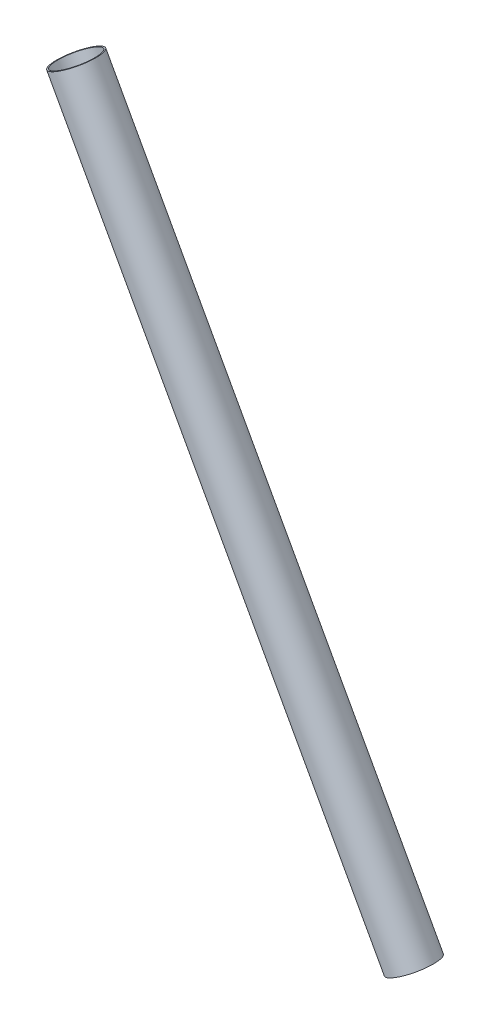
ISO-10303-21;
HEADER;
FILE_DESCRIPTION(('STEP AP214'),'2;1');
FILE_NAME('part.step','',(''),(''),'','','');
FILE_SCHEMA(('AUTOMOTIVE_DESIGN { 1 0 10303 214 1 1 1 1 }'));
ENDSEC;
DATA;
#1=APPLICATION_CONTEXT('core data for automotive mechanical design processes');
#2=APPLICATION_PROTOCOL_DEFINITION('international standard','automotive_design',2000,#1);
#3=PRODUCT_CONTEXT('',#1,'mechanical');
#4=PRODUCT('Part','Part','',(#3));
#5=PRODUCT_RELATED_PRODUCT_CATEGORY('part','',(#4));
#6=PRODUCT_DEFINITION_FORMATION('','',#4);
#7=PRODUCT_DEFINITION_CONTEXT('part definition',#1,'design');
#8=PRODUCT_DEFINITION('design','',#6,#7);
#9=PRODUCT_DEFINITION_SHAPE('','',#8);
#10=(LENGTH_UNIT() NAMED_UNIT(*) SI_UNIT(.MILLI.,.METRE.));
#11=(NAMED_UNIT(*) PLANE_ANGLE_UNIT() SI_UNIT($,.RADIAN.));
#12=(NAMED_UNIT(*) SI_UNIT($,.STERADIAN.) SOLID_ANGLE_UNIT());
#13=UNCERTAINTY_MEASURE_WITH_UNIT(LENGTH_MEASURE(1.E-05),#10,'distance_accuracy_value','');
#14=(GEOMETRIC_REPRESENTATION_CONTEXT(3) GLOBAL_UNCERTAINTY_ASSIGNED_CONTEXT((#13)) GLOBAL_UNIT_ASSIGNED_CONTEXT((#10,
#11,#12)) REPRESENTATION_CONTEXT('',''));
#15=CARTESIAN_POINT('',(0.,0.,0.));
#16=DIRECTION('',(0.,0.,1.));
#17=DIRECTION('',(1.,0.,0.));
#18=AXIS2_PLACEMENT_3D('',#15,#16,#17);
#19=CARTESIAN_POINT('',(-328.619941220099,746.118381252741,0.));
#20=DIRECTION('',(-0.480781588258264,0.876840387067031,0.));
#21=DIRECTION('',(-0.876840387067032,-0.480781588258263,0.));
#22=AXIS2_PLACEMENT_3D('',#19,#20,#21);
#23=CYLINDRICAL_SURFACE('',#22,25.3999999999946);
#24=CARTESIAN_POINT('',(-328.619941220099,746.11838125274,0.));
#25=DIRECTION('',(-0.480781588258264,0.876840387067031,0.));
#26=DIRECTION('',(-0.876840387067032,-0.480781588258263,0.));
#27=AXIS2_PLACEMENT_3D('',#24,#25,#26);
#28=CIRCLE('',#27,25.3999999999996);
#29=CARTESIAN_POINT('',(-350.891687051597,733.906528910983,0.));
#30=VERTEX_POINT('',#29);
#31=EDGE_CURVE('E10',#30,#30,#28,.T.);
#32=CARTESIAN_POINT('',(56.0534075453374,44.558387560409,0.));
#33=DIRECTION('',(-0.480781588258264,0.876840387067031,0.));
#34=DIRECTION('',(-0.876840387067032,-0.480781588258263,0.));
#35=AXIS2_PLACEMENT_3D('',#32,#33,#34);
#36=CIRCLE('',#35,25.3999999999895);
#37=CARTESIAN_POINT('',(33.7816617138396,32.3465352186516,0.));
#38=VERTEX_POINT('',#37);
#39=EDGE_CURVE('E46',#38,#38,#36,.T.);
#40=CARTESIAN_POINT('',(-350.891687051597,733.906528910983,0.));
#41=CARTESIAN_POINT('',(-346.884673001957,726.598612310021,0.));
#42=CARTESIAN_POINT('',(-342.877658952317,719.290695709059,0.));
#43=CARTESIAN_POINT('',(-334.863630853037,704.674862507136,0.));
#44=CARTESIAN_POINT('',(-330.856616803397,697.366945906174,0.));
#45=CARTESIAN_POINT('',(-322.842588704117,682.751112704251,0.));
#46=CARTESIAN_POINT('',(-318.835574654477,675.443196103289,0.));
#47=CARTESIAN_POINT('',(-310.821546555197,660.827362901365,0.));
#48=CARTESIAN_POINT('',(-306.814532505557,653.519446300403,0.));
#49=CARTESIAN_POINT('',(-298.800504406277,638.90361309848,0.));
#50=CARTESIAN_POINT('',(-294.793490356637,631.595696497518,0.));
#51=CARTESIAN_POINT('',(-286.779462257358,616.979863295595,0.));
#52=CARTESIAN_POINT('',(-282.772448207718,609.671946694633,0.));
#53=CARTESIAN_POINT('',(-274.758420108438,595.056113492709,0.));
#54=CARTESIAN_POINT('',(-270.751406058798,587.748196891747,0.));
#55=CARTESIAN_POINT('',(-262.737377959518,573.132363689824,0.));
#56=CARTESIAN_POINT('',(-258.730363909878,565.824447088862,0.));
#57=CARTESIAN_POINT('',(-250.716335810598,551.208613886938,0.));
#58=CARTESIAN_POINT('',(-246.709321760958,543.900697285977,0.));
#59=CARTESIAN_POINT('',(-238.695293661678,529.284864084053,0.));
#60=CARTESIAN_POINT('',(-234.688279612038,521.976947483091,0.));
#61=CARTESIAN_POINT('',(-226.674251512758,507.361114281168,0.));
#62=CARTESIAN_POINT('',(-222.667237463118,500.053197680206,0.));
#63=CARTESIAN_POINT('',(-214.653209363838,485.437364478282,0.));
#64=CARTESIAN_POINT('',(-210.646195314198,478.129447877321,0.));
#65=CARTESIAN_POINT('',(-202.632167214918,463.513614675397,0.));
#66=CARTESIAN_POINT('',(-198.625153165278,456.205698074435,0.));
#67=CARTESIAN_POINT('',(-190.611125065998,441.589864872512,0.));
#68=CARTESIAN_POINT('',(-186.604111016358,434.28194827155,0.));
#69=CARTESIAN_POINT('',(-178.590082917079,419.666115069626,0.));
#70=CARTESIAN_POINT('',(-174.583068867439,412.358198468665,0.));
#71=CARTESIAN_POINT('',(-166.569040768159,397.742365266741,0.));
#72=CARTESIAN_POINT('',(-162.562026718519,390.434448665779,0.));
#73=CARTESIAN_POINT('',(-154.547998619239,375.818615463856,0.));
#74=CARTESIAN_POINT('',(-150.540984569599,368.510698862894,0.));
#75=CARTESIAN_POINT('',(-142.526956470319,353.89486566097,0.));
#76=CARTESIAN_POINT('',(-138.519942420679,346.586949060008,0.));
#77=CARTESIAN_POINT('',(-130.505914321399,331.971115858085,0.));
#78=CARTESIAN_POINT('',(-126.498900271759,324.663199257123,0.));
#79=CARTESIAN_POINT('',(-118.484872172479,310.0473660552,0.));
#80=CARTESIAN_POINT('',(-114.477858122839,302.739449454238,0.));
#81=CARTESIAN_POINT('',(-106.463830023559,288.123616252314,0.));
#82=CARTESIAN_POINT('',(-102.456815973919,280.815699651352,0.));
#83=CARTESIAN_POINT('',(-94.4427878746393,266.199866449429,0.));
#84=CARTESIAN_POINT('',(-90.4357738249993,258.891949848467,0.));
#85=CARTESIAN_POINT('',(-82.4217457257194,244.276116646543,0.));
#86=CARTESIAN_POINT('',(-78.4147316760794,236.968200045582,0.));
#87=CARTESIAN_POINT('',(-70.4007035767995,222.352366843658,0.));
#88=CARTESIAN_POINT('',(-66.3936895271595,215.044450242696,0.));
#89=CARTESIAN_POINT('',(-58.3796614278796,200.428617040773,0.));
#90=CARTESIAN_POINT('',(-54.3726473782396,193.120700439811,0.));
#91=CARTESIAN_POINT('',(-46.3586192789597,178.504867237887,0.));
#92=CARTESIAN_POINT('',(-42.3516052293198,171.196950636926,0.));
#93=CARTESIAN_POINT('',(-34.3375771300398,156.581117435002,0.));
#94=CARTESIAN_POINT('',(-30.3305630803999,149.27320083404,0.));
#95=CARTESIAN_POINT('',(-22.3165349811199,134.657367632117,0.));
#96=CARTESIAN_POINT('',(-18.30952093148,127.349451031155,0.));
#97=CARTESIAN_POINT('',(-10.2954928322,112.733617829231,0.));
#98=CARTESIAN_POINT('',(-6.28847878256003,105.425701228269,0.));
#99=CARTESIAN_POINT('',(1.72554931671987,90.8098680263459,0.));
#100=CARTESIAN_POINT('',(5.7325633663598,83.5019514253842,0.));
#101=CARTESIAN_POINT('',(13.7465914656397,68.8861182234606,0.));
#102=CARTESIAN_POINT('',(17.7536055152797,61.5782016224988,0.));
#103=CARTESIAN_POINT('',(25.7676336145596,46.9623684205752,0.));
#104=CARTESIAN_POINT('',(29.7746476641996,39.6544518196134,0.));
#105=CARTESIAN_POINT('',(33.7816617138396,32.3465352186516,0.));
#106=B_SPLINE_CURVE_WITH_KNOTS('',3,(#40,#41,#42,#43,#44,#45,#46,#47,#48,#49,#50,#51,#52,#53,
#54,#55,#56,#57,#58,#59,#60,#61,#62,#63,#64,#65,#66,#67,#68,#69,#70,#71,#72,#73,#74,#75,#76,#77,
#78,#79,#80,#81,#82,#83,#84,#85,#86,#87,#88,#89,#90,#91,#92,#93,#94,#95,#96,#97,#98,#99,#100,
#101,#102,#103,#104,#105),.UNSPECIFIED.,.F.,.F.,(4,2,2,2,2,2,2,2,2,2,2,2,2,2,2,2,2,2,2,2,2,2,2,
2,2,2,2,2,2,2,2,2,4),(0.,25.003125,50.00625,75.0093749999999,100.0125,125.015625,150.01875,
175.021875,200.025,225.028125,250.03125,275.034375,300.0375,325.040625,350.04375,375.046875,
400.05,425.053125,450.05625,475.059375,500.0625,525.065625,550.06875,575.071875,600.075,
625.078125,650.08125,675.084375,700.0875,725.090625,750.09375,775.096875,800.1),.UNSPECIFIED.);
#107=EDGE_CURVE('BSEAM39',#30,#38,#106,.T.);
#108=ORIENTED_EDGE('',*,*,#31,.F.);
#109=ORIENTED_EDGE('',*,*,#39,.T.);
#110=ORIENTED_EDGE('',*,*,#107,.T.);
#111=ORIENTED_EDGE('',*,*,#107,.F.);
#112=EDGE_LOOP('',(#108,#110,#109,#111));
#113=FACE_BOUND('',#112,.T.);
#114=ADVANCED_FACE('F39',(#113),#23,.T.);
#115=CARTESIAN_POINT('',(-328.619941220099,746.118381252741,0.));
#116=DIRECTION('',(0.480781588258264,-0.876840387067031,0.));
#117=DIRECTION('',(0.876840387067032,0.480781588258263,0.));
#118=AXIS2_PLACEMENT_3D('',#115,#116,#117);
#119=PLANE('',#118);
#120=CARTESIAN_POINT('',(-328.619941220099,746.118381252741,0.));
#121=DIRECTION('',(0.480781588258264,-0.876840387067031,0.));
#122=DIRECTION('',(0.876840387067032,0.480781588258263,0.));
#123=AXIS2_PLACEMENT_3D('',#120,#121,#122);
#124=CIRCLE('',#123,23.8124999999946);
#125=CARTESIAN_POINT('',(-349.499702937128,734.669769682343,0.));
#126=VERTEX_POINT('',#125);
#127=EDGE_CURVE('E52',#126,#126,#124,.F.);
#128=ORIENTED_EDGE('',*,*,#127,.F.);
#129=EDGE_LOOP('',(#128));
#130=FACE_BOUND('',#129,.T.);
#131=ORIENTED_EDGE('',*,*,#31,.T.);
#132=EDGE_LOOP('',(#131));
#133=FACE_BOUND('',#132,.T.);
#134=ADVANCED_FACE('F76',(#130,#133),#119,.F.);
#135=CARTESIAN_POINT('',(56.0534075453373,44.558387560409,0.));
#136=DIRECTION('',(-0.480781588258264,0.876840387067031,0.));
#137=DIRECTION('',(-0.876840387067032,-0.480781588258263,0.));
#138=AXIS2_PLACEMENT_3D('',#135,#136,#137);
#139=PLANE('',#138);
#140=CARTESIAN_POINT('',(56.0534075453374,44.558387560409,0.));
#141=DIRECTION('',(-0.480781588258264,0.876840387067031,0.));
#142=DIRECTION('',(-0.876840387067032,-0.480781588258263,0.));
#143=AXIS2_PLACEMENT_3D('',#140,#141,#142);
#144=CIRCLE('',#143,23.8124999999946);
#145=CARTESIAN_POINT('',(35.1736458283085,33.1097759900116,0.));
#146=VERTEX_POINT('',#145);
#147=EDGE_CURVE('E58',#146,#146,#144,.T.);
#148=ORIENTED_EDGE('',*,*,#147,.T.);
#149=EDGE_LOOP('',(#148));
#150=FACE_BOUND('',#149,.T.);
#151=ORIENTED_EDGE('',*,*,#39,.F.);
#152=EDGE_LOOP('',(#151));
#153=FACE_BOUND('',#152,.T.);
#154=ADVANCED_FACE('F66',(#150,#153),#139,.F.);
#155=CARTESIAN_POINT('',(-328.619941220099,746.118381252741,0.));
#156=DIRECTION('',(-0.480781588258264,0.876840387067031,0.));
#157=DIRECTION('',(-0.876840387067032,-0.480781588258263,0.));
#158=AXIS2_PLACEMENT_3D('',#155,#156,#157);
#159=CYLINDRICAL_SURFACE('',#158,23.8124999999946);
#160=CARTESIAN_POINT('',(-349.499702937128,734.669769682343,0.));
#161=CARTESIAN_POINT('',(-345.492688887488,727.361853081381,0.));
#162=CARTESIAN_POINT('',(-341.485674837848,720.05393648042,0.));
#163=CARTESIAN_POINT('',(-333.471646738568,705.438103278496,0.));
#164=CARTESIAN_POINT('',(-329.464632688928,698.130186677534,0.));
#165=CARTESIAN_POINT('',(-321.450604589648,683.514353475611,0.));
#166=CARTESIAN_POINT('',(-317.443590540008,676.206436874649,0.));
#167=CARTESIAN_POINT('',(-309.429562440728,661.590603672725,0.));
#168=CARTESIAN_POINT('',(-305.422548391089,654.282687071764,0.));
#169=CARTESIAN_POINT('',(-297.408520291809,639.66685386984,0.));
#170=CARTESIAN_POINT('',(-293.401506242169,632.358937268878,0.));
#171=CARTESIAN_POINT('',(-285.387478142889,617.743104066955,0.));
#172=CARTESIAN_POINT('',(-281.380464093249,610.435187465993,0.));
#173=CARTESIAN_POINT('',(-273.366435993969,595.819354264069,0.));
#174=CARTESIAN_POINT('',(-269.359421944329,588.511437663108,0.));
#175=CARTESIAN_POINT('',(-261.345393845049,573.895604461184,0.));
#176=CARTESIAN_POINT('',(-257.338379795409,566.587687860222,0.));
#177=CARTESIAN_POINT('',(-249.324351696129,551.971854658299,0.));
#178=CARTESIAN_POINT('',(-245.317337646489,544.663938057337,0.));
#179=CARTESIAN_POINT('',(-237.303309547209,530.048104855413,0.));
#180=CARTESIAN_POINT('',(-233.296295497569,522.740188254451,0.));
#181=CARTESIAN_POINT('',(-225.282267398289,508.124355052528,0.));
#182=CARTESIAN_POINT('',(-221.275253348649,500.816438451566,0.));
#183=CARTESIAN_POINT('',(-213.261225249369,486.200605249642,0.));
#184=CARTESIAN_POINT('',(-209.254211199729,478.892688648681,0.));
#185=CARTESIAN_POINT('',(-201.240183100449,464.276855446757,0.));
#186=CARTESIAN_POINT('',(-197.23316905081,456.968938845795,0.));
#187=CARTESIAN_POINT('',(-189.21914095153,442.353105643872,0.));
#188=CARTESIAN_POINT('',(-185.21212690189,435.04518904291,0.));
#189=CARTESIAN_POINT('',(-177.19809880261,420.429355840986,0.));
#190=CARTESIAN_POINT('',(-173.19108475297,413.121439240025,0.));
#191=CARTESIAN_POINT('',(-165.17705665369,398.505606038101,0.));
#192=CARTESIAN_POINT('',(-161.17004260405,391.197689437139,0.));
#193=CARTESIAN_POINT('',(-153.15601450477,376.581856235216,0.));
#194=CARTESIAN_POINT('',(-149.14900045513,369.273939634254,0.));
#195=CARTESIAN_POINT('',(-141.13497235585,354.65810643233,0.));
#196=CARTESIAN_POINT('',(-137.12795830621,347.350189831369,0.));
#197=CARTESIAN_POINT('',(-129.11393020693,332.734356629445,0.));
#198=CARTESIAN_POINT('',(-125.10691615729,325.426440028483,0.));
#199=CARTESIAN_POINT('',(-117.09288805801,310.81060682656,0.));
#200=CARTESIAN_POINT('',(-113.08587400837,303.502690225598,0.));
#201=CARTESIAN_POINT('',(-105.07184590909,288.886857023674,0.));
#202=CARTESIAN_POINT('',(-101.06483185945,281.578940422712,0.));
#203=CARTESIAN_POINT('',(-93.0508037601704,266.963107220789,0.));
#204=CARTESIAN_POINT('',(-89.0437897105304,259.655190619827,0.));
#205=CARTESIAN_POINT('',(-81.0297616112505,245.039357417903,0.));
#206=CARTESIAN_POINT('',(-77.0227475616106,237.731440816942,0.));
#207=CARTESIAN_POINT('',(-69.0087194623306,223.115607615018,0.));
#208=CARTESIAN_POINT('',(-65.0017054126907,215.807691014056,0.));
#209=CARTESIAN_POINT('',(-56.9876773134107,201.191857812133,0.));
#210=CARTESIAN_POINT('',(-52.9806632637708,193.883941211171,0.));
#211=CARTESIAN_POINT('',(-44.9666351644909,179.268108009247,0.));
#212=CARTESIAN_POINT('',(-40.9596211148509,171.960191408286,0.));
#213=CARTESIAN_POINT('',(-32.9455930155709,157.344358206362,0.));
#214=CARTESIAN_POINT('',(-28.938578965931,150.0364416054,0.));
#215=CARTESIAN_POINT('',(-20.924550866651,135.420608403477,0.));
#216=CARTESIAN_POINT('',(-16.9175368170111,128.112691802515,0.));
#217=CARTESIAN_POINT('',(-8.90350871773114,113.496858600591,0.));
#218=CARTESIAN_POINT('',(-4.89649466809118,106.18894199963,0.));
#219=CARTESIAN_POINT('',(3.11753343118873,91.5731087977061,0.));
#220=CARTESIAN_POINT('',(7.12454748082868,84.2651921967443,0.));
#221=CARTESIAN_POINT('',(15.1385755801086,69.6493589948206,0.));
#222=CARTESIAN_POINT('',(19.1455896297486,62.3414423938588,0.));
#223=CARTESIAN_POINT('',(27.1596177290285,47.7256091919352,0.));
#224=CARTESIAN_POINT('',(31.1666317786685,40.4176925909734,0.));
#225=CARTESIAN_POINT('',(35.1736458283085,33.1097759900116,0.));
#226=B_SPLINE_CURVE_WITH_KNOTS('',3,(#160,#161,#162,#163,#164,#165,#166,#167,#168,#169,#170,
#171,#172,#173,#174,#175,#176,#177,#178,#179,#180,#181,#182,#183,#184,#185,#186,#187,#188,#189,
#190,#191,#192,#193,#194,#195,#196,#197,#198,#199,#200,#201,#202,#203,#204,#205,#206,#207,#208,
#209,#210,#211,#212,#213,#214,#215,#216,#217,#218,#219,#220,#221,#222,#223,#224,#225),
.UNSPECIFIED.,.F.,.F.,(4,2,2,2,2,2,2,2,2,2,2,2,2,2,2,2,2,2,2,2,2,2,2,2,2,2,2,2,2,2,2,2,4),(0.,
25.0031249999999,50.00625,75.0093749999999,100.0125,125.015625,150.01875,175.021875,200.025,
225.028125,250.03125,275.034375,300.0375,325.040625,350.04375,375.046875,400.05,425.053125,
450.05625,475.059375,500.0625,525.065625,550.06875,575.071875,600.075,625.078125,650.08125,
675.084375,700.0875,725.090625,750.09375,775.096875,800.1),.UNSPECIFIED.);
#227=EDGE_CURVE('BSEAM69',#126,#146,#226,.T.);
#228=ORIENTED_EDGE('',*,*,#127,.T.);
#229=ORIENTED_EDGE('',*,*,#147,.F.);
#230=ORIENTED_EDGE('',*,*,#227,.T.);
#231=ORIENTED_EDGE('',*,*,#227,.F.);
#232=EDGE_LOOP('',(#228,#230,#229,#231));
#233=FACE_BOUND('',#232,.T.);
#234=ADVANCED_FACE('F69',(#233),#159,.F.);
#235=CLOSED_SHELL('',(#114,#134,#154,#234));
#236=MANIFOLD_SOLID_BREP('B2',#235);
#237=ADVANCED_BREP_SHAPE_REPRESENTATION('',(#18,#236),#14);
#238=SHAPE_DEFINITION_REPRESENTATION(#9,#237);
ENDSEC;
END-ISO-10303-21;
